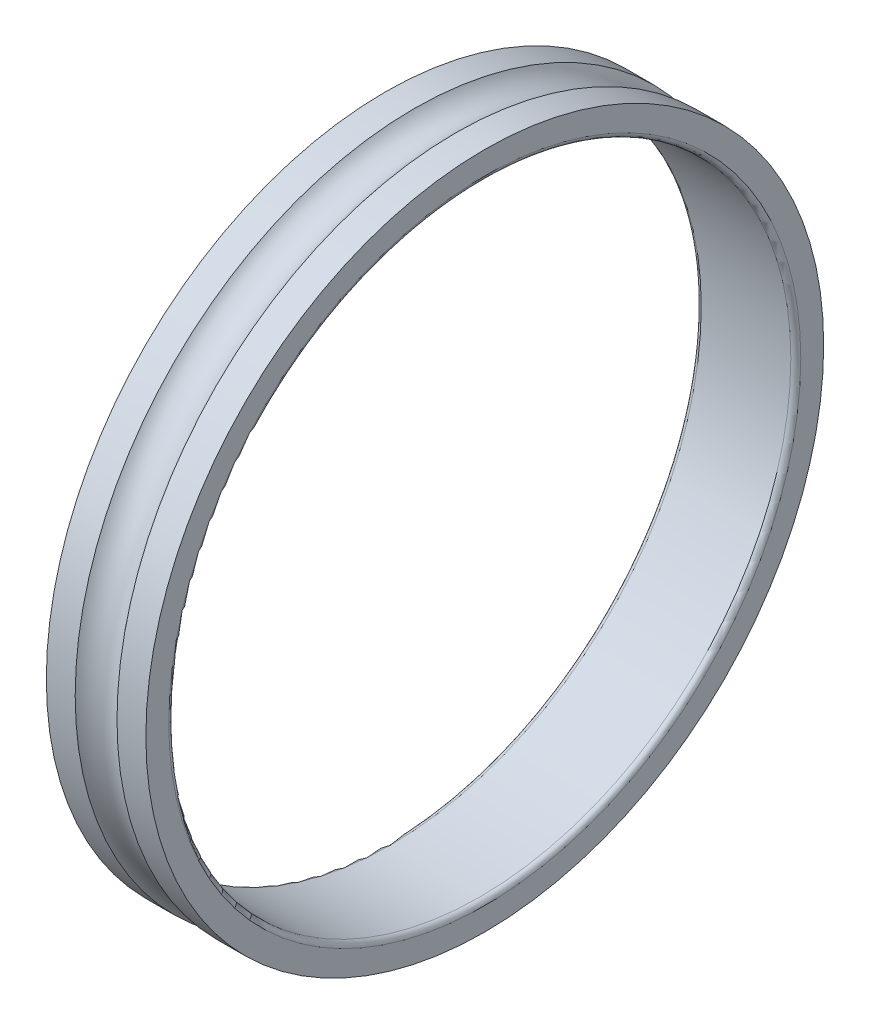
ISO-10303-21;
HEADER;
FILE_DESCRIPTION(('STEP AP214'),'2;1');
FILE_NAME('part.step','',(''),(''),'','','');
FILE_SCHEMA(('AUTOMOTIVE_DESIGN { 1 0 10303 214 1 1 1 1 }'));
ENDSEC;
DATA;
#1=APPLICATION_CONTEXT('core data for automotive mechanical design processes');
#2=APPLICATION_PROTOCOL_DEFINITION('international standard','automotive_design',2000,#1);
#3=PRODUCT_CONTEXT('',#1,'mechanical');
#4=PRODUCT('Part','Part','',(#3));
#5=PRODUCT_RELATED_PRODUCT_CATEGORY('part','',(#4));
#6=PRODUCT_DEFINITION_FORMATION('','',#4);
#7=PRODUCT_DEFINITION_CONTEXT('part definition',#1,'design');
#8=PRODUCT_DEFINITION('design','',#6,#7);
#9=PRODUCT_DEFINITION_SHAPE('','',#8);
#10=(LENGTH_UNIT() NAMED_UNIT(*) SI_UNIT(.MILLI.,.METRE.));
#11=(NAMED_UNIT(*) PLANE_ANGLE_UNIT() SI_UNIT($,.RADIAN.));
#12=(NAMED_UNIT(*) SI_UNIT($,.STERADIAN.) SOLID_ANGLE_UNIT());
#13=UNCERTAINTY_MEASURE_WITH_UNIT(LENGTH_MEASURE(1.E-05),#10,'distance_accuracy_value','');
#14=(GEOMETRIC_REPRESENTATION_CONTEXT(3) GLOBAL_UNCERTAINTY_ASSIGNED_CONTEXT((#13)) GLOBAL_UNIT_ASSIGNED_CONTEXT((#10,
#11,#12)) REPRESENTATION_CONTEXT('',''));
#15=CARTESIAN_POINT('',(0.,0.,0.));
#16=DIRECTION('',(0.,0.,1.));
#17=DIRECTION('',(1.,0.,0.));
#18=AXIS2_PLACEMENT_3D('',#15,#16,#17);
#19=CARTESIAN_POINT('',(0.,-13.8730098017767,-13.62));
#20=DIRECTION('',(-1.,0.,0.));
#21=DIRECTION('',(0.,0.,1.));
#22=AXIS2_PLACEMENT_3D('',#19,#20,#21);
#23=PLANE('',#22);
#24=CARTESIAN_POINT('',(0.,0.,0.));
#25=DIRECTION('',(-1.,0.,0.));
#26=DIRECTION('',(0.,0.,-1.));
#27=AXIS2_PLACEMENT_3D('',#24,#25,#26);
#28=CIRCLE('',#27,13.62);
#29=CARTESIAN_POINT('',(0.,0.,-13.62));
#30=VERTEX_POINT('',#29);
#31=EDGE_CURVE('E43',#30,#30,#28,.F.);
#32=ORIENTED_EDGE('',*,*,#31,.F.);
#33=EDGE_LOOP('',(#32));
#34=FACE_BOUND('',#33,.T.);
#35=CARTESIAN_POINT('',(0.,0.,0.));
#36=DIRECTION('',(1.,0.,0.));
#37=DIRECTION('',(0.,-1.16841689429576E-09,1.));
#38=AXIS2_PLACEMENT_3D('',#35,#36,#37);
#39=CIRCLE('',#38,12.7000000000005);
#40=CARTESIAN_POINT('',(0.,-1.48388945575568E-08,12.7000000000005));
#41=VERTEX_POINT('',#40);
#42=EDGE_CURVE('E40',#41,#41,#39,.T.);
#43=ORIENTED_EDGE('',*,*,#42,.T.);
#44=EDGE_LOOP('',(#43));
#45=FACE_BOUND('',#44,.T.);
#46=ADVANCED_FACE('F14',(#34,#45),#23,.T.);
#47=CARTESIAN_POINT('',(4.,-13.8730098017767,13.62));
#48=DIRECTION('',(1.,0.,0.));
#49=DIRECTION('',(0.,0.,-1.));
#50=AXIS2_PLACEMENT_3D('',#47,#48,#49);
#51=PLANE('',#50);
#52=CARTESIAN_POINT('',(4.,0.,0.));
#53=DIRECTION('',(1.,0.,0.));
#54=DIRECTION('',(0.,0.,1.));
#55=AXIS2_PLACEMENT_3D('',#52,#53,#54);
#56=CIRCLE('',#55,13.62);
#57=CARTESIAN_POINT('',(4.,0.,13.62));
#58=VERTEX_POINT('',#57);
#59=EDGE_CURVE('E37',#58,#58,#56,.T.);
#60=ORIENTED_EDGE('',*,*,#59,.T.);
#61=EDGE_LOOP('',(#60));
#62=FACE_BOUND('',#61,.T.);
#63=CARTESIAN_POINT('',(4.,0.,0.));
#64=DIRECTION('',(-1.,0.,0.));
#65=DIRECTION('',(0.,0.,-1.));
#66=AXIS2_PLACEMENT_3D('',#63,#64,#65);
#67=CIRCLE('',#66,12.7000000098849);
#68=CARTESIAN_POINT('',(4.,0.,-12.7000000098849));
#69=VERTEX_POINT('',#68);
#70=EDGE_CURVE('E34',#69,#69,#67,.F.);
#71=ORIENTED_EDGE('',*,*,#70,.F.);
#72=EDGE_LOOP('',(#71));
#73=FACE_BOUND('',#72,.T.);
#74=ADVANCED_FACE('F51',(#62,#73),#51,.T.);
#75=CARTESIAN_POINT('',(0.200000000000524,0.,0.));
#76=DIRECTION('',(1.,0.,0.));
#77=DIRECTION('',(0.,0.,1.));
#78=AXIS2_PLACEMENT_3D('',#75,#76,#77);
#79=TOROIDAL_SURFACE('',#78,12.7000000000005,0.200000000000524);
#80=CARTESIAN_POINT('',(0.2,0.,0.));
#81=DIRECTION('',(1.,0.,0.));
#82=DIRECTION('',(0.,0.,1.));
#83=AXIS2_PLACEMENT_3D('',#80,#81,#82);
#84=CIRCLE('',#83,12.5);
#85=CARTESIAN_POINT('',(0.2,0.,12.5));
#86=VERTEX_POINT('',#85);
#87=EDGE_CURVE('E29',#86,#86,#84,.T.);
#88=ORIENTED_EDGE('',*,*,#87,.T.);
#89=EDGE_LOOP('',(#88));
#90=FACE_BOUND('',#89,.T.);
#91=ORIENTED_EDGE('',*,*,#42,.F.);
#92=EDGE_LOOP('',(#91));
#93=FACE_BOUND('',#92,.T.);
#94=ADVANCED_FACE('F55',(#90,#93),#79,.T.);
#95=CARTESIAN_POINT('',(4.,0.,0.));
#96=DIRECTION('',(1.,0.,0.));
#97=DIRECTION('',(0.,0.,1.));
#98=AXIS2_PLACEMENT_3D('',#95,#96,#97);
#99=CYLINDRICAL_SURFACE('',#98,12.5);
#100=CARTESIAN_POINT('',(3.8,0.,0.));
#101=DIRECTION('',(1.,0.,0.));
#102=DIRECTION('',(0.,0.,1.));
#103=AXIS2_PLACEMENT_3D('',#100,#101,#102);
#104=CIRCLE('',#103,12.5);
#105=CARTESIAN_POINT('',(3.8,0.,12.5));
#106=VERTEX_POINT('',#105);
#107=EDGE_CURVE('E25',#106,#106,#104,.T.);
#108=ORIENTED_EDGE('',*,*,#107,.T.);
#109=EDGE_LOOP('',(#108));
#110=FACE_BOUND('',#109,.T.);
#111=ORIENTED_EDGE('',*,*,#87,.F.);
#112=EDGE_LOOP('',(#111));
#113=FACE_BOUND('',#112,.T.);
#114=ADVANCED_FACE('F57',(#110,#113),#99,.F.);
#115=CARTESIAN_POINT('',(3.79999999999946,0.,0.));
#116=DIRECTION('',(1.,0.,0.));
#117=DIRECTION('',(0.,0.,1.));
#118=AXIS2_PLACEMENT_3D('',#115,#116,#117);
#119=TOROIDAL_SURFACE('',#118,12.7000000000005,0.20000000000054);
#120=ORIENTED_EDGE('',*,*,#70,.T.);
#121=EDGE_LOOP('',(#120));
#122=FACE_BOUND('',#121,.T.);
#123=ORIENTED_EDGE('',*,*,#107,.F.);
#124=EDGE_LOOP('',(#123));
#125=FACE_BOUND('',#124,.T.);
#126=ADVANCED_FACE('F65',(#122,#125),#119,.T.);
#127=CARTESIAN_POINT('',(4.,0.,0.));
#128=DIRECTION('',(1.,0.,0.));
#129=DIRECTION('',(0.,0.,1.));
#130=AXIS2_PLACEMENT_3D('',#127,#128,#129);
#131=CYLINDRICAL_SURFACE('',#130,13.62);
#132=CARTESIAN_POINT('',(2.84,0.,0.));
#133=DIRECTION('',(1.,0.,0.));
#134=DIRECTION('',(0.,0.,1.));
#135=AXIS2_PLACEMENT_3D('',#132,#133,#134);
#136=CIRCLE('',#135,13.62);
#137=CARTESIAN_POINT('',(2.84,0.,13.62));
#138=VERTEX_POINT('',#137);
#139=EDGE_CURVE('E21',#138,#138,#136,.T.);
#140=ORIENTED_EDGE('',*,*,#139,.T.);
#141=EDGE_LOOP('',(#140));
#142=FACE_BOUND('',#141,.T.);
#143=ORIENTED_EDGE('',*,*,#59,.F.);
#144=EDGE_LOOP('',(#143));
#145=FACE_BOUND('',#144,.T.);
#146=ADVANCED_FACE('F73',(#142,#145),#131,.T.);
#147=CARTESIAN_POINT('',(2.,0.,0.));
#148=DIRECTION('',(1.,0.,0.));
#149=DIRECTION('',(0.,0.,1.));
#150=AXIS2_PLACEMENT_3D('',#147,#148,#149);
#151=TOROIDAL_SURFACE('',#150,14.25,1.05);
#152=ORIENTED_EDGE('',*,*,#139,.F.);
#153=EDGE_LOOP('',(#152));
#154=FACE_BOUND('',#153,.T.);
#155=CARTESIAN_POINT('',(1.16,0.,0.));
#156=DIRECTION('',(1.,0.,0.));
#157=DIRECTION('',(0.,0.,1.));
#158=AXIS2_PLACEMENT_3D('',#155,#156,#157);
#159=CIRCLE('',#158,13.62);
#160=CARTESIAN_POINT('',(1.16,0.,13.62));
#161=VERTEX_POINT('',#160);
#162=EDGE_CURVE('E9',#161,#161,#159,.T.);
#163=ORIENTED_EDGE('',*,*,#162,.T.);
#164=EDGE_LOOP('',(#163));
#165=FACE_BOUND('',#164,.T.);
#166=ADVANCED_FACE('F76',(#154,#165),#151,.F.);
#167=CARTESIAN_POINT('',(4.,0.,0.));
#168=DIRECTION('',(1.,0.,0.));
#169=DIRECTION('',(0.,0.,1.));
#170=AXIS2_PLACEMENT_3D('',#167,#168,#169);
#171=CYLINDRICAL_SURFACE('',#170,13.62);
#172=ORIENTED_EDGE('',*,*,#31,.T.);
#173=EDGE_LOOP('',(#172));
#174=FACE_BOUND('',#173,.T.);
#175=ORIENTED_EDGE('',*,*,#162,.F.);
#176=EDGE_LOOP('',(#175));
#177=FACE_BOUND('',#176,.T.);
#178=ADVANCED_FACE('F16',(#174,#177),#171,.T.);
#179=CLOSED_SHELL('',(#46,#74,#94,#114,#126,#146,#166,#178));
#180=MANIFOLD_SOLID_BREP('B1',#179);
#181=ADVANCED_BREP_SHAPE_REPRESENTATION('',(#18,#180),#14);
#182=SHAPE_DEFINITION_REPRESENTATION(#9,#181);
ENDSEC;
END-ISO-10303-21;
